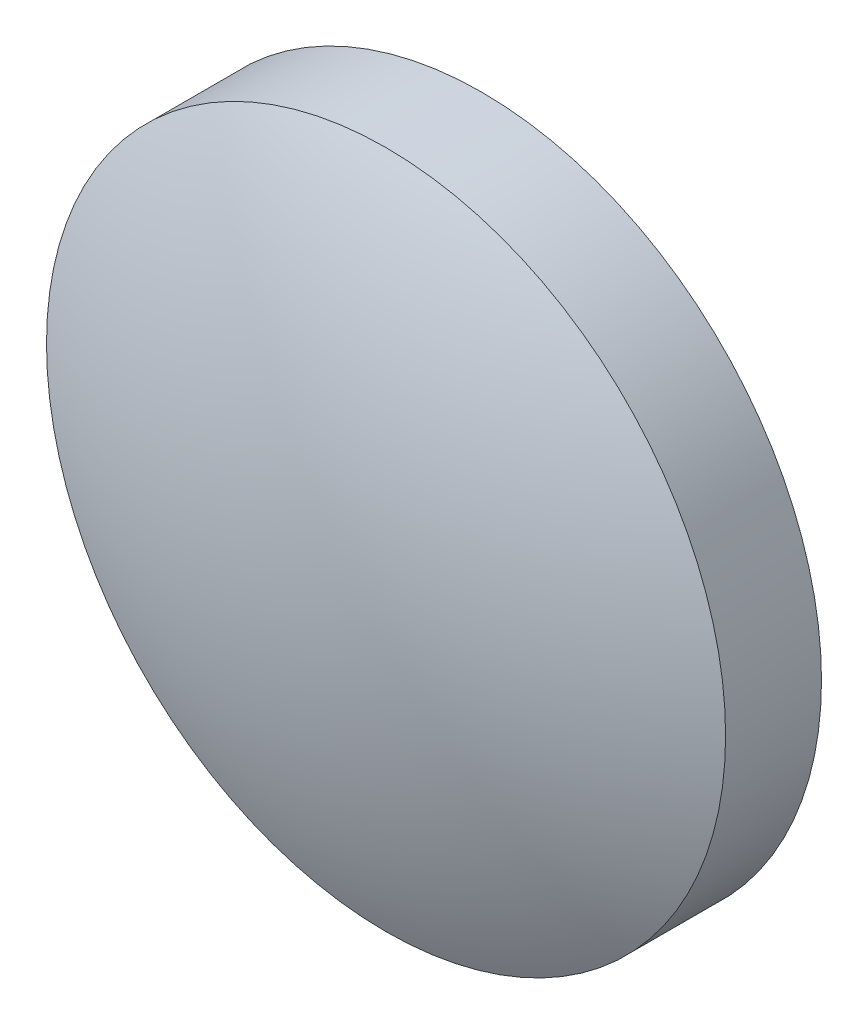
ISO-10303-21;
HEADER;
FILE_DESCRIPTION(('STEP AP214'),'2;1');
FILE_NAME('part.step','',(''),(''),'','','');
FILE_SCHEMA(('AUTOMOTIVE_DESIGN { 1 0 10303 214 1 1 1 1 }'));
ENDSEC;
DATA;
#1=APPLICATION_CONTEXT('core data for automotive mechanical design processes');
#2=APPLICATION_PROTOCOL_DEFINITION('international standard','automotive_design',2000,#1);
#3=PRODUCT_CONTEXT('',#1,'mechanical');
#4=PRODUCT('Part','Part','',(#3));
#5=PRODUCT_RELATED_PRODUCT_CATEGORY('part','',(#4));
#6=PRODUCT_DEFINITION_FORMATION('','',#4);
#7=PRODUCT_DEFINITION_CONTEXT('part definition',#1,'design');
#8=PRODUCT_DEFINITION('design','',#6,#7);
#9=PRODUCT_DEFINITION_SHAPE('','',#8);
#10=(LENGTH_UNIT() NAMED_UNIT(*) SI_UNIT(.MILLI.,.METRE.));
#11=(NAMED_UNIT(*) PLANE_ANGLE_UNIT() SI_UNIT($,.RADIAN.));
#12=(NAMED_UNIT(*) SI_UNIT($,.STERADIAN.) SOLID_ANGLE_UNIT());
#13=UNCERTAINTY_MEASURE_WITH_UNIT(LENGTH_MEASURE(1.E-05),#10,'distance_accuracy_value','');
#14=(GEOMETRIC_REPRESENTATION_CONTEXT(3) GLOBAL_UNCERTAINTY_ASSIGNED_CONTEXT((#13)) GLOBAL_UNIT_ASSIGNED_CONTEXT((#10,
#11,#12)) REPRESENTATION_CONTEXT('',''));
#15=CARTESIAN_POINT('',(0.,0.,0.));
#16=DIRECTION('',(0.,0.,1.));
#17=DIRECTION('',(1.,0.,0.));
#18=AXIS2_PLACEMENT_3D('',#15,#16,#17);
#19=CARTESIAN_POINT('',(0.,0.,12.25));
#20=DIRECTION('',(0.,0.,1.));
#21=DIRECTION('',(0.,1.,0.));
#22=AXIS2_PLACEMENT_3D('',#19,#20,#21);
#23=SPHERICAL_SURFACE('',#22,14.6);
#24=CARTESIAN_POINT('',(0.,0.,-0.89676766357419));
#25=DIRECTION('',(0.,0.,1.));
#26=DIRECTION('',(1.,0.,0.));
#27=AXIS2_PLACEMENT_3D('',#24,#25,#26);
#28=CIRCLE('',#27,6.35000000000001);
#29=CARTESIAN_POINT('',(6.35000000000001,0.,-0.89676766357419));
#30=VERTEX_POINT('',#29);
#31=EDGE_CURVE('E10',#30,#30,#28,.T.);
#32=ORIENTED_EDGE('',*,*,#31,.F.);
#33=EDGE_LOOP('',(#32));
#34=FACE_BOUND('',#33,.T.);
#35=ADVANCED_FACE('F17',(#34),#23,.T.);
#36=CARTESIAN_POINT('',(0.,0.,6.49100038893206));
#37=DIRECTION('',(0.,0.,1.));
#38=DIRECTION('',(1.,0.,0.));
#39=AXIS2_PLACEMENT_3D('',#36,#37,#38);
#40=CYLINDRICAL_SURFACE('',#39,6.35000000000001);
#41=CARTESIAN_POINT('',(0.,0.,0.896767663574192));
#42=DIRECTION('',(0.,0.,1.));
#43=DIRECTION('',(1.,0.,0.));
#44=AXIS2_PLACEMENT_3D('',#41,#42,#43);
#45=CIRCLE('',#44,6.35000000000001);
#46=CARTESIAN_POINT('',(6.35000000000001,0.,0.896767663574192));
#47=VERTEX_POINT('',#46);
#48=EDGE_CURVE('E23',#47,#47,#45,.T.);
#49=ORIENTED_EDGE('',*,*,#48,.F.);
#50=EDGE_LOOP('',(#49));
#51=FACE_BOUND('',#50,.T.);
#52=ORIENTED_EDGE('',*,*,#31,.T.);
#53=EDGE_LOOP('',(#52));
#54=FACE_BOUND('',#53,.T.);
#55=ADVANCED_FACE('F31',(#51,#54),#40,.T.);
#56=CARTESIAN_POINT('',(0.,0.,-12.25));
#57=DIRECTION('',(0.,0.,1.));
#58=DIRECTION('',(0.,1.,0.));
#59=AXIS2_PLACEMENT_3D('',#56,#57,#58);
#60=SPHERICAL_SURFACE('',#59,14.6);
#61=ORIENTED_EDGE('',*,*,#48,.T.);
#62=EDGE_LOOP('',(#61));
#63=FACE_BOUND('',#62,.T.);
#64=ADVANCED_FACE('F29',(#63),#60,.T.);
#65=CLOSED_SHELL('',(#35,#55,#64));
#66=MANIFOLD_SOLID_BREP('B1',#65);
#67=ADVANCED_BREP_SHAPE_REPRESENTATION('',(#18,#66),#14);
#68=SHAPE_DEFINITION_REPRESENTATION(#9,#67);
ENDSEC;
END-ISO-10303-21;
